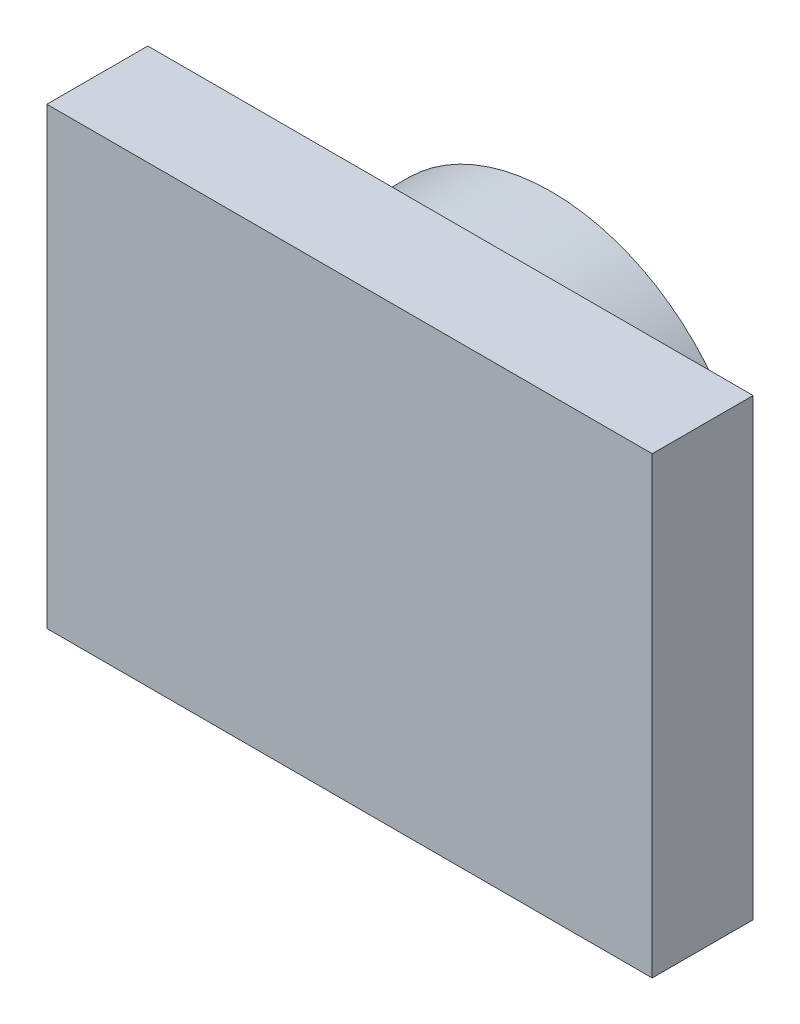
ISO-10303-21;
HEADER;
FILE_DESCRIPTION(('STEP AP214'),'2;1');
FILE_NAME('part.step','',(''),(''),'','','');
FILE_SCHEMA(('AUTOMOTIVE_DESIGN { 1 0 10303 214 1 1 1 1 }'));
ENDSEC;
DATA;
#1=APPLICATION_CONTEXT('core data for automotive mechanical design processes');
#2=APPLICATION_PROTOCOL_DEFINITION('international standard','automotive_design',2000,#1);
#3=PRODUCT_CONTEXT('',#1,'mechanical');
#4=PRODUCT('Part','Part','',(#3));
#5=PRODUCT_RELATED_PRODUCT_CATEGORY('part','',(#4));
#6=PRODUCT_DEFINITION_FORMATION('','',#4);
#7=PRODUCT_DEFINITION_CONTEXT('part definition',#1,'design');
#8=PRODUCT_DEFINITION('design','',#6,#7);
#9=PRODUCT_DEFINITION_SHAPE('','',#8);
#10=(LENGTH_UNIT() NAMED_UNIT(*) SI_UNIT(.MILLI.,.METRE.));
#11=(NAMED_UNIT(*) PLANE_ANGLE_UNIT() SI_UNIT($,.RADIAN.));
#12=(NAMED_UNIT(*) SI_UNIT($,.STERADIAN.) SOLID_ANGLE_UNIT());
#13=UNCERTAINTY_MEASURE_WITH_UNIT(LENGTH_MEASURE(1.E-05),#10,'distance_accuracy_value','');
#14=(GEOMETRIC_REPRESENTATION_CONTEXT(3) GLOBAL_UNCERTAINTY_ASSIGNED_CONTEXT((#13)) GLOBAL_UNIT_ASSIGNED_CONTEXT((#10,
#11,#12)) REPRESENTATION_CONTEXT('',''));
#15=CARTESIAN_POINT('',(0.,0.,0.));
#16=DIRECTION('',(0.,0.,1.));
#17=DIRECTION('',(1.,0.,0.));
#18=AXIS2_PLACEMENT_3D('',#15,#16,#17);
#19=CARTESIAN_POINT('',(0.,0.,10.));
#20=DIRECTION('',(0.,0.,-1.));
#21=DIRECTION('',(-1.,0.,0.));
#22=AXIS2_PLACEMENT_3D('',#19,#20,#21);
#23=CYLINDRICAL_SURFACE('',#22,20.);
#24=CARTESIAN_POINT('',(0.,0.,10.));
#25=DIRECTION('',(0.,0.,1.));
#26=DIRECTION('',(1.,0.,0.));
#27=AXIS2_PLACEMENT_3D('',#24,#25,#26);
#28=CIRCLE('',#27,20.);
#29=CARTESIAN_POINT('',(20.,0.,10.));
#30=VERTEX_POINT('',#29);
#31=EDGE_CURVE('E11',#30,#30,#28,.T.);
#32=ORIENTED_EDGE('',*,*,#31,.F.);
#33=EDGE_LOOP('',(#32));
#34=FACE_BOUND('',#33,.T.);
#35=CARTESIAN_POINT('',(0.,0.,0.));
#36=DIRECTION('',(0.,0.,1.));
#37=DIRECTION('',(1.,0.,0.));
#38=AXIS2_PLACEMENT_3D('',#35,#36,#37);
#39=CIRCLE('',#38,20.);
#40=CARTESIAN_POINT('',(20.,0.,0.));
#41=VERTEX_POINT('',#40);
#42=EDGE_CURVE('E42',#41,#41,#39,.T.);
#43=ORIENTED_EDGE('',*,*,#42,.T.);
#44=EDGE_LOOP('',(#43));
#45=FACE_BOUND('',#44,.T.);
#46=ADVANCED_FACE('F39',(#34,#45),#23,.T.);
#47=CARTESIAN_POINT('',(0.,0.,0.));
#48=DIRECTION('',(0.,0.,1.));
#49=DIRECTION('',(1.,0.,0.));
#50=AXIS2_PLACEMENT_3D('',#47,#48,#49);
#51=PLANE('',#50);
#52=ORIENTED_EDGE('',*,*,#42,.F.);
#53=EDGE_LOOP('',(#52));
#54=FACE_BOUND('',#53,.T.);
#55=ADVANCED_FACE('F131',(#54),#51,.F.);
#56=CARTESIAN_POINT('',(30.,22.5,20.));
#57=DIRECTION('',(-1.,0.,0.));
#58=DIRECTION('',(0.,0.,1.));
#59=AXIS2_PLACEMENT_3D('',#56,#57,#58);
#60=PLANE('',#59);
#61=DIRECTION('',(0.,1.,0.));
#62=VECTOR('',#61,1.);
#63=CARTESIAN_POINT('',(30.,22.5,10.));
#64=LINE('',#63,#62);
#65=CARTESIAN_POINT('',(30.,-22.5,10.));
#66=VERTEX_POINT('',#65);
#67=CARTESIAN_POINT('',(30.,22.5,10.));
#68=VERTEX_POINT('',#67);
#69=EDGE_CURVE('E111',#66,#68,#64,.T.);
#70=ORIENTED_EDGE('',*,*,#69,.T.);
#71=DIRECTION('',(0.,0.,-1.));
#72=VECTOR('',#71,1.);
#73=CARTESIAN_POINT('',(30.,22.5,20.));
#74=LINE('',#73,#72);
#75=CARTESIAN_POINT('',(30.,22.5,20.));
#76=VERTEX_POINT('',#75);
#77=EDGE_CURVE('E100',#76,#68,#74,.T.);
#78=ORIENTED_EDGE('',*,*,#77,.F.);
#79=DIRECTION('',(0.,1.,0.));
#80=VECTOR('',#79,1.);
#81=CARTESIAN_POINT('',(30.,22.5,20.));
#82=LINE('',#81,#80);
#83=CARTESIAN_POINT('',(30.,-22.5,20.));
#84=VERTEX_POINT('',#83);
#85=EDGE_CURVE('E92',#84,#76,#82,.T.);
#86=ORIENTED_EDGE('',*,*,#85,.F.);
#87=DIRECTION('',(0.,0.,-1.));
#88=VECTOR('',#87,1.);
#89=CARTESIAN_POINT('',(30.,-22.5,20.));
#90=LINE('',#89,#88);
#91=EDGE_CURVE('E107',#84,#66,#90,.T.);
#92=ORIENTED_EDGE('',*,*,#91,.T.);
#93=EDGE_LOOP('',(#70,#78,#86,#92));
#94=FACE_BOUND('',#93,.T.);
#95=ADVANCED_FACE('F133',(#94),#60,.F.);
#96=CARTESIAN_POINT('',(-30.,22.5,20.));
#97=DIRECTION('',(0.,-1.,0.));
#98=DIRECTION('',(0.,0.,-1.));
#99=AXIS2_PLACEMENT_3D('',#96,#97,#98);
#100=PLANE('',#99);
#101=DIRECTION('',(-1.,0.,0.));
#102=VECTOR('',#101,1.);
#103=CARTESIAN_POINT('',(-30.,22.5,10.));
#104=LINE('',#103,#102);
#105=CARTESIAN_POINT('',(-30.,22.5,10.));
#106=VERTEX_POINT('',#105);
#107=EDGE_CURVE('E98',#68,#106,#104,.T.);
#108=ORIENTED_EDGE('',*,*,#107,.T.);
#109=DIRECTION('',(0.,0.,-1.));
#110=VECTOR('',#109,1.);
#111=CARTESIAN_POINT('',(-30.,22.5,20.));
#112=LINE('',#111,#110);
#113=CARTESIAN_POINT('',(-30.,22.5,20.));
#114=VERTEX_POINT('',#113);
#115=EDGE_CURVE('E96',#114,#106,#112,.T.);
#116=ORIENTED_EDGE('',*,*,#115,.F.);
#117=DIRECTION('',(-1.,0.,0.));
#118=VECTOR('',#117,1.);
#119=CARTESIAN_POINT('',(-30.,22.5,20.));
#120=LINE('',#119,#118);
#121=EDGE_CURVE('E87',#76,#114,#120,.T.);
#122=ORIENTED_EDGE('',*,*,#121,.F.);
#123=ORIENTED_EDGE('',*,*,#77,.T.);
#124=EDGE_LOOP('',(#108,#116,#122,#123));
#125=FACE_BOUND('',#124,.T.);
#126=ADVANCED_FACE('F97',(#125),#100,.F.);
#127=CARTESIAN_POINT('',(-30.,22.5,20.));
#128=DIRECTION('',(1.,0.,0.));
#129=DIRECTION('',(0.,0.,-1.));
#130=AXIS2_PLACEMENT_3D('',#127,#128,#129);
#131=PLANE('',#130);
#132=DIRECTION('',(0.,-1.,0.));
#133=VECTOR('',#132,1.);
#134=CARTESIAN_POINT('',(-30.,22.5,10.));
#135=LINE('',#134,#133);
#136=CARTESIAN_POINT('',(-30.,-22.5,10.));
#137=VERTEX_POINT('',#136);
#138=EDGE_CURVE('E73',#106,#137,#135,.T.);
#139=ORIENTED_EDGE('',*,*,#138,.T.);
#140=DIRECTION('',(0.,0.,-1.));
#141=VECTOR('',#140,1.);
#142=CARTESIAN_POINT('',(-30.,-22.5,20.));
#143=LINE('',#142,#141);
#144=CARTESIAN_POINT('',(-30.,-22.5,20.));
#145=VERTEX_POINT('',#144);
#146=EDGE_CURVE('E101',#145,#137,#143,.T.);
#147=ORIENTED_EDGE('',*,*,#146,.F.);
#148=DIRECTION('',(0.,-1.,0.));
#149=VECTOR('',#148,1.);
#150=CARTESIAN_POINT('',(-30.,22.5,20.));
#151=LINE('',#150,#149);
#152=EDGE_CURVE('E90',#114,#145,#151,.T.);
#153=ORIENTED_EDGE('',*,*,#152,.F.);
#154=ORIENTED_EDGE('',*,*,#115,.T.);
#155=EDGE_LOOP('',(#139,#147,#153,#154));
#156=FACE_BOUND('',#155,.T.);
#157=ADVANCED_FACE('F103',(#156),#131,.F.);
#158=CARTESIAN_POINT('',(-30.,-22.5,20.));
#159=DIRECTION('',(0.,1.,0.));
#160=DIRECTION('',(0.,0.,1.));
#161=AXIS2_PLACEMENT_3D('',#158,#159,#160);
#162=PLANE('',#161);
#163=DIRECTION('',(1.,0.,0.));
#164=VECTOR('',#163,1.);
#165=CARTESIAN_POINT('',(-30.,-22.5,10.));
#166=LINE('',#165,#164);
#167=EDGE_CURVE('E79',#137,#66,#166,.T.);
#168=ORIENTED_EDGE('',*,*,#167,.T.);
#169=ORIENTED_EDGE('',*,*,#91,.F.);
#170=DIRECTION('',(1.,0.,0.));
#171=VECTOR('',#170,1.);
#172=CARTESIAN_POINT('',(-30.,-22.5,20.));
#173=LINE('',#172,#171);
#174=EDGE_CURVE('E56',#145,#84,#173,.T.);
#175=ORIENTED_EDGE('',*,*,#174,.F.);
#176=ORIENTED_EDGE('',*,*,#146,.T.);
#177=EDGE_LOOP('',(#168,#169,#175,#176));
#178=FACE_BOUND('',#177,.T.);
#179=ADVANCED_FACE('F146',(#178),#162,.F.);
#180=CARTESIAN_POINT('',(0.,0.,20.));
#181=DIRECTION('',(0.,0.,1.));
#182=DIRECTION('',(1.,0.,0.));
#183=AXIS2_PLACEMENT_3D('',#180,#181,#182);
#184=PLANE('',#183);
#185=ORIENTED_EDGE('',*,*,#85,.T.);
#186=ORIENTED_EDGE('',*,*,#121,.T.);
#187=ORIENTED_EDGE('',*,*,#152,.T.);
#188=ORIENTED_EDGE('',*,*,#174,.T.);
#189=EDGE_LOOP('',(#185,#186,#187,#188));
#190=FACE_BOUND('',#189,.T.);
#191=ADVANCED_FACE('F88',(#190),#184,.T.);
#192=CARTESIAN_POINT('',(0.,0.,10.));
#193=DIRECTION('',(0.,0.,1.));
#194=DIRECTION('',(1.,0.,0.));
#195=AXIS2_PLACEMENT_3D('',#192,#193,#194);
#196=PLANE('',#195);
#197=ORIENTED_EDGE('',*,*,#31,.T.);
#198=EDGE_LOOP('',(#197));
#199=FACE_BOUND('',#198,.T.);
#200=ORIENTED_EDGE('',*,*,#69,.F.);
#201=ORIENTED_EDGE('',*,*,#167,.F.);
#202=ORIENTED_EDGE('',*,*,#138,.F.);
#203=ORIENTED_EDGE('',*,*,#107,.F.);
#204=EDGE_LOOP('',(#200,#201,#202,#203));
#205=FACE_BOUND('',#204,.T.);
#206=ADVANCED_FACE('F149',(#199,#205),#196,.F.);
#207=CLOSED_SHELL('',(#46,#55,#95,#126,#157,#179,#191,#206));
#208=MANIFOLD_SOLID_BREP('B2',#207);
#209=ADVANCED_BREP_SHAPE_REPRESENTATION('',(#18,#208),#14);
#210=SHAPE_DEFINITION_REPRESENTATION(#9,#209);
ENDSEC;
END-ISO-10303-21;
